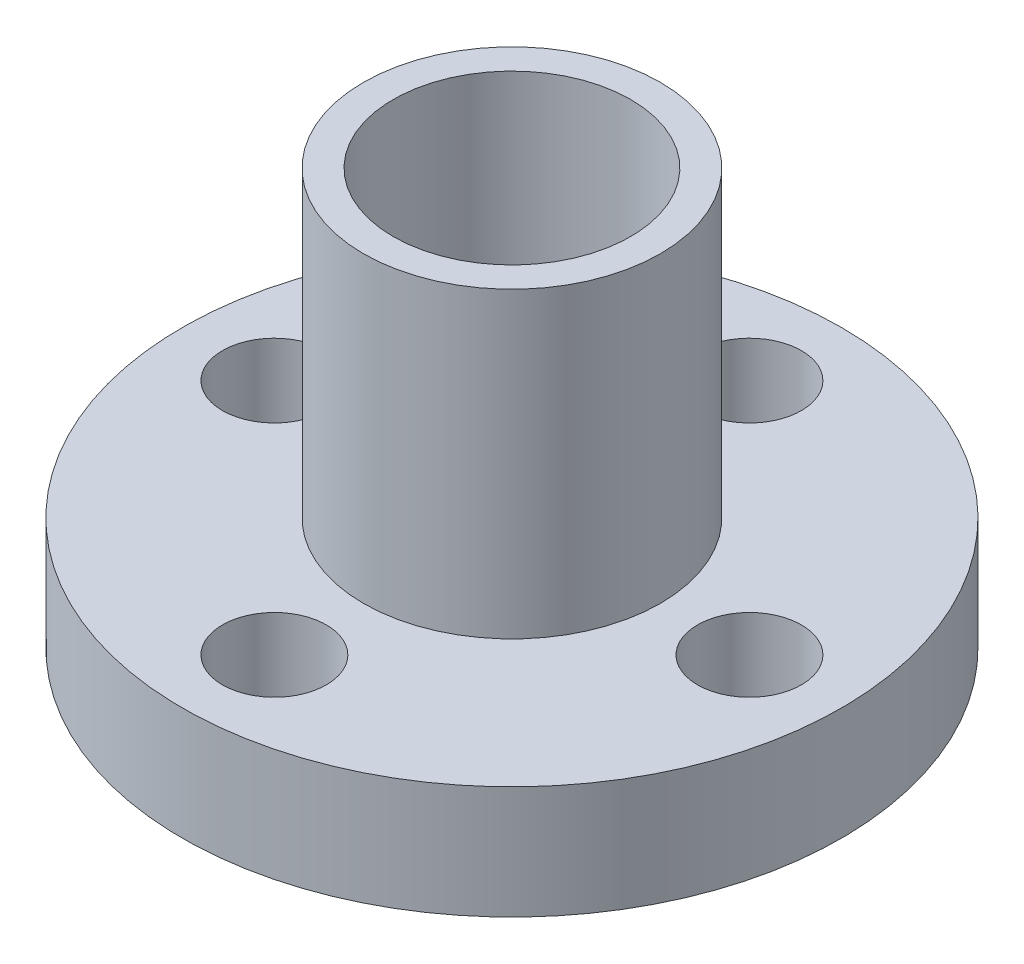
ISO-10303-21;
HEADER;
FILE_DESCRIPTION(('STEP AP214'),'2;1');
FILE_NAME('part.step','',(''),(''),'','','');
FILE_SCHEMA(('AUTOMOTIVE_DESIGN { 1 0 10303 214 1 1 1 1 }'));
ENDSEC;
DATA;
#1=APPLICATION_CONTEXT('core data for automotive mechanical design processes');
#2=APPLICATION_PROTOCOL_DEFINITION('international standard','automotive_design',2000,#1);
#3=PRODUCT_CONTEXT('',#1,'mechanical');
#4=PRODUCT('Part','Part','',(#3));
#5=PRODUCT_RELATED_PRODUCT_CATEGORY('part','',(#4));
#6=PRODUCT_DEFINITION_FORMATION('','',#4);
#7=PRODUCT_DEFINITION_CONTEXT('part definition',#1,'design');
#8=PRODUCT_DEFINITION('design','',#6,#7);
#9=PRODUCT_DEFINITION_SHAPE('','',#8);
#10=(LENGTH_UNIT() NAMED_UNIT(*) SI_UNIT(.MILLI.,.METRE.));
#11=(NAMED_UNIT(*) PLANE_ANGLE_UNIT() SI_UNIT($,.RADIAN.));
#12=(NAMED_UNIT(*) SI_UNIT($,.STERADIAN.) SOLID_ANGLE_UNIT());
#13=UNCERTAINTY_MEASURE_WITH_UNIT(LENGTH_MEASURE(1.E-05),#10,'distance_accuracy_value','');
#14=(GEOMETRIC_REPRESENTATION_CONTEXT(3) GLOBAL_UNCERTAINTY_ASSIGNED_CONTEXT((#13)) GLOBAL_UNIT_ASSIGNED_CONTEXT((#10,
#11,#12)) REPRESENTATION_CONTEXT('',''));
#15=CARTESIAN_POINT('',(0.,0.,0.));
#16=DIRECTION('',(0.,0.,1.));
#17=DIRECTION('',(1.,0.,0.));
#18=AXIS2_PLACEMENT_3D('',#15,#16,#17);
#19=CARTESIAN_POINT('',(0.,0.,0.));
#20=DIRECTION('',(0.,1.,0.));
#21=DIRECTION('',(0.,0.,1.));
#22=AXIS2_PLACEMENT_3D('',#19,#20,#21);
#23=PLANE('',#22);
#24=CARTESIAN_POINT('',(0.,0.,-8.));
#25=DIRECTION('',(0.,1.,0.));
#26=DIRECTION('',(0.,0.,1.));
#27=AXIS2_PLACEMENT_3D('',#24,#25,#26);
#28=CIRCLE('',#27,1.75);
#29=CARTESIAN_POINT('',(0.,0.,-6.25));
#30=VERTEX_POINT('',#29);
#31=EDGE_CURVE('E34',#30,#30,#28,.T.);
#32=ORIENTED_EDGE('',*,*,#31,.T.);
#33=EDGE_LOOP('',(#32));
#34=FACE_BOUND('',#33,.T.);
#35=CARTESIAN_POINT('',(0.,0.,8.));
#36=DIRECTION('',(0.,1.,0.));
#37=DIRECTION('',(0.,0.,1.));
#38=AXIS2_PLACEMENT_3D('',#35,#36,#37);
#39=CIRCLE('',#38,1.75);
#40=CARTESIAN_POINT('',(0.,0.,9.75));
#41=VERTEX_POINT('',#40);
#42=EDGE_CURVE('E74',#41,#41,#39,.T.);
#43=ORIENTED_EDGE('',*,*,#42,.T.);
#44=EDGE_LOOP('',(#43));
#45=FACE_BOUND('',#44,.T.);
#46=CARTESIAN_POINT('',(8.,0.,0.));
#47=DIRECTION('',(0.,1.,0.));
#48=DIRECTION('',(0.,0.,1.));
#49=AXIS2_PLACEMENT_3D('',#46,#47,#48);
#50=CIRCLE('',#49,1.75);
#51=CARTESIAN_POINT('',(8.,0.,1.75));
#52=VERTEX_POINT('',#51);
#53=EDGE_CURVE('E68',#52,#52,#50,.T.);
#54=ORIENTED_EDGE('',*,*,#53,.T.);
#55=EDGE_LOOP('',(#54));
#56=FACE_BOUND('',#55,.T.);
#57=CARTESIAN_POINT('',(-8.,0.,0.));
#58=DIRECTION('',(0.,1.,0.));
#59=DIRECTION('',(0.,0.,1.));
#60=AXIS2_PLACEMENT_3D('',#57,#58,#59);
#61=CIRCLE('',#60,1.75);
#62=CARTESIAN_POINT('',(-8.,0.,1.75));
#63=VERTEX_POINT('',#62);
#64=EDGE_CURVE('E62',#63,#63,#61,.T.);
#65=ORIENTED_EDGE('',*,*,#64,.T.);
#66=EDGE_LOOP('',(#65));
#67=FACE_BOUND('',#66,.T.);
#68=CARTESIAN_POINT('',(0.,0.,0.));
#69=DIRECTION('',(0.,1.,0.));
#70=DIRECTION('',(0.,0.,1.));
#71=AXIS2_PLACEMENT_3D('',#68,#69,#70);
#72=CIRCLE('',#71,11.1);
#73=CARTESIAN_POINT('',(0.,0.,-11.1));
#74=VERTEX_POINT('',#73);
#75=EDGE_CURVE('E42',#74,#74,#72,.T.);
#76=ORIENTED_EDGE('',*,*,#75,.F.);
#77=EDGE_LOOP('',(#76));
#78=FACE_BOUND('',#77,.T.);
#79=CARTESIAN_POINT('',(0.,0.,0.));
#80=DIRECTION('',(0.,1.,0.));
#81=DIRECTION('',(0.,0.,1.));
#82=AXIS2_PLACEMENT_3D('',#79,#80,#81);
#83=CIRCLE('',#82,5.09);
#84=CARTESIAN_POINT('',(0.,0.,5.09));
#85=VERTEX_POINT('',#84);
#86=EDGE_CURVE('E10',#85,#85,#83,.F.);
#87=ORIENTED_EDGE('',*,*,#86,.F.);
#88=EDGE_LOOP('',(#87));
#89=FACE_BOUND('',#88,.T.);
#90=ADVANCED_FACE('F30',(#34,#45,#56,#67,#78,#89),#23,.F.);
#91=CARTESIAN_POINT('',(0.,3.8,0.));
#92=DIRECTION('',(0.,-1.,0.));
#93=DIRECTION('',(0.,0.,-1.));
#94=AXIS2_PLACEMENT_3D('',#91,#92,#93);
#95=CYLINDRICAL_SURFACE('',#94,11.1);
#96=CARTESIAN_POINT('',(0.,3.8,0.));
#97=DIRECTION('',(0.,1.,0.));
#98=DIRECTION('',(0.,0.,1.));
#99=AXIS2_PLACEMENT_3D('',#96,#97,#98);
#100=CIRCLE('',#99,11.1);
#101=CARTESIAN_POINT('',(0.,3.8,-11.1));
#102=VERTEX_POINT('',#101);
#103=EDGE_CURVE('E38',#102,#102,#100,.T.);
#104=CARTESIAN_POINT('',(0.,3.8,-11.1));
#105=CARTESIAN_POINT('',(0.,3.76041666666667,-11.1));
#106=CARTESIAN_POINT('',(0.,3.72083333333333,-11.1));
#107=CARTESIAN_POINT('',(0.,3.64166666666667,-11.1));
#108=CARTESIAN_POINT('',(0.,3.60208333333333,-11.1));
#109=CARTESIAN_POINT('',(0.,3.52291666666667,-11.1));
#110=CARTESIAN_POINT('',(0.,3.48333333333333,-11.1));
#111=CARTESIAN_POINT('',(0.,3.40416666666667,-11.1));
#112=CARTESIAN_POINT('',(0.,3.36458333333333,-11.1));
#113=CARTESIAN_POINT('',(0.,3.28541666666667,-11.1));
#114=CARTESIAN_POINT('',(0.,3.24583333333333,-11.1));
#115=CARTESIAN_POINT('',(0.,3.16666666666667,-11.1));
#116=CARTESIAN_POINT('',(0.,3.12708333333333,-11.1));
#117=CARTESIAN_POINT('',(0.,3.04791666666667,-11.1));
#118=CARTESIAN_POINT('',(0.,3.00833333333333,-11.1));
#119=CARTESIAN_POINT('',(0.,2.92916666666667,-11.1));
#120=CARTESIAN_POINT('',(0.,2.88958333333333,-11.1));
#121=CARTESIAN_POINT('',(0.,2.81041666666667,-11.1));
#122=CARTESIAN_POINT('',(0.,2.77083333333333,-11.1));
#123=CARTESIAN_POINT('',(0.,2.69166666666667,-11.1));
#124=CARTESIAN_POINT('',(0.,2.65208333333333,-11.1));
#125=CARTESIAN_POINT('',(0.,2.57291666666667,-11.1));
#126=CARTESIAN_POINT('',(0.,2.53333333333333,-11.1));
#127=CARTESIAN_POINT('',(0.,2.45416666666667,-11.1));
#128=CARTESIAN_POINT('',(0.,2.41458333333333,-11.1));
#129=CARTESIAN_POINT('',(0.,2.33541666666667,-11.1));
#130=CARTESIAN_POINT('',(0.,2.29583333333333,-11.1));
#131=CARTESIAN_POINT('',(0.,2.21666666666667,-11.1));
#132=CARTESIAN_POINT('',(0.,2.17708333333333,-11.1));
#133=CARTESIAN_POINT('',(0.,2.09791666666667,-11.1));
#134=CARTESIAN_POINT('',(0.,2.05833333333333,-11.1));
#135=CARTESIAN_POINT('',(0.,1.97916666666667,-11.1));
#136=CARTESIAN_POINT('',(0.,1.93958333333333,-11.1));
#137=CARTESIAN_POINT('',(0.,1.86041666666667,-11.1));
#138=CARTESIAN_POINT('',(0.,1.82083333333333,-11.1));
#139=CARTESIAN_POINT('',(0.,1.74166666666667,-11.1));
#140=CARTESIAN_POINT('',(0.,1.70208333333333,-11.1));
#141=CARTESIAN_POINT('',(0.,1.62291666666667,-11.1));
#142=CARTESIAN_POINT('',(0.,1.58333333333333,-11.1));
#143=CARTESIAN_POINT('',(0.,1.50416666666667,-11.1));
#144=CARTESIAN_POINT('',(0.,1.46458333333333,-11.1));
#145=CARTESIAN_POINT('',(0.,1.38541666666667,-11.1));
#146=CARTESIAN_POINT('',(0.,1.34583333333333,-11.1));
#147=CARTESIAN_POINT('',(0.,1.26666666666667,-11.1));
#148=CARTESIAN_POINT('',(0.,1.22708333333333,-11.1));
#149=CARTESIAN_POINT('',(0.,1.14791666666667,-11.1));
#150=CARTESIAN_POINT('',(0.,1.10833333333333,-11.1));
#151=CARTESIAN_POINT('',(0.,1.02916666666667,-11.1));
#152=CARTESIAN_POINT('',(0.,0.989583333333334,-11.1));
#153=CARTESIAN_POINT('',(0.,0.910416666666667,-11.1));
#154=CARTESIAN_POINT('',(0.,0.870833333333333,-11.1));
#155=CARTESIAN_POINT('',(0.,0.791666666666667,-11.1));
#156=CARTESIAN_POINT('',(0.,0.752083333333333,-11.1));
#157=CARTESIAN_POINT('',(0.,0.672916666666667,-11.1));
#158=CARTESIAN_POINT('',(0.,0.633333333333333,-11.1));
#159=CARTESIAN_POINT('',(0.,0.554166666666667,-11.1));
#160=CARTESIAN_POINT('',(0.,0.514583333333334,-11.1));
#161=CARTESIAN_POINT('',(0.,0.435416666666667,-11.1));
#162=CARTESIAN_POINT('',(0.,0.395833333333334,-11.1));
#163=CARTESIAN_POINT('',(0.,0.316666666666667,-11.1));
#164=CARTESIAN_POINT('',(0.,0.277083333333333,-11.1));
#165=CARTESIAN_POINT('',(0.,0.197916666666667,-11.1));
#166=CARTESIAN_POINT('',(0.,0.158333333333333,-11.1));
#167=CARTESIAN_POINT('',(0.,0.0791666666666666,-11.1));
#168=CARTESIAN_POINT('',(0.,0.0395833333333333,-11.1));
#169=CARTESIAN_POINT('',(0.,0.,-11.1));
#170=B_SPLINE_CURVE_WITH_KNOTS('',3,(#104,#105,#106,#107,#108,#109,#110,#111,#112,#113,#114,
#115,#116,#117,#118,#119,#120,#121,#122,#123,#124,#125,#126,#127,#128,#129,#130,#131,#132,#133,
#134,#135,#136,#137,#138,#139,#140,#141,#142,#143,#144,#145,#146,#147,#148,#149,#150,#151,#152,
#153,#154,#155,#156,#157,#158,#159,#160,#161,#162,#163,#164,#165,#166,#167,#168,#169),
.UNSPECIFIED.,.F.,.F.,(4,2,2,2,2,2,2,2,2,2,2,2,2,2,2,2,2,2,2,2,2,2,2,2,2,2,2,2,2,2,2,2,4),(0.,
0.11875,0.2375,0.35625,0.475,0.59375,0.7125,0.83125,0.95,1.06875,1.1875,1.30625,1.425,1.54375,
1.6625,1.78125,1.9,2.01875,2.1375,2.25625,2.375,2.49375,2.6125,2.73125,2.85,2.96875,3.0875,
3.20625,3.325,3.44375,3.5625,3.68125,3.8),.UNSPECIFIED.);
#171=EDGE_CURVE('BSEAM32',#102,#74,#170,.T.);
#172=ORIENTED_EDGE('',*,*,#103,.F.);
#173=ORIENTED_EDGE('',*,*,#75,.T.);
#174=ORIENTED_EDGE('',*,*,#171,.T.);
#175=ORIENTED_EDGE('',*,*,#171,.F.);
#176=EDGE_LOOP('',(#172,#174,#173,#175));
#177=FACE_BOUND('',#176,.T.);
#178=ADVANCED_FACE('F32',(#177),#95,.T.);
#179=CARTESIAN_POINT('',(0.,3.8,0.));
#180=DIRECTION('',(0.,1.,0.));
#181=DIRECTION('',(0.,0.,1.));
#182=AXIS2_PLACEMENT_3D('',#179,#180,#181);
#183=PLANE('',#182);
#184=CARTESIAN_POINT('',(0.,3.8,-8.));
#185=DIRECTION('',(0.,1.,0.));
#186=DIRECTION('',(0.,0.,1.));
#187=AXIS2_PLACEMENT_3D('',#184,#185,#186);
#188=CIRCLE('',#187,1.75);
#189=CARTESIAN_POINT('',(0.,3.8,-6.25));
#190=VERTEX_POINT('',#189);
#191=EDGE_CURVE('E80',#190,#190,#188,.T.);
#192=ORIENTED_EDGE('',*,*,#191,.F.);
#193=EDGE_LOOP('',(#192));
#194=FACE_BOUND('',#193,.T.);
#195=CARTESIAN_POINT('',(0.,3.8,8.));
#196=DIRECTION('',(0.,1.,0.));
#197=DIRECTION('',(0.,0.,1.));
#198=AXIS2_PLACEMENT_3D('',#195,#196,#197);
#199=CIRCLE('',#198,1.75);
#200=CARTESIAN_POINT('',(0.,3.8,9.75));
#201=VERTEX_POINT('',#200);
#202=EDGE_CURVE('E77',#201,#201,#199,.T.);
#203=ORIENTED_EDGE('',*,*,#202,.F.);
#204=EDGE_LOOP('',(#203));
#205=FACE_BOUND('',#204,.T.);
#206=CARTESIAN_POINT('',(8.,3.8,0.));
#207=DIRECTION('',(0.,1.,0.));
#208=DIRECTION('',(0.,0.,1.));
#209=AXIS2_PLACEMENT_3D('',#206,#207,#208);
#210=CIRCLE('',#209,1.75);
#211=CARTESIAN_POINT('',(8.,3.8,1.75));
#212=VERTEX_POINT('',#211);
#213=EDGE_CURVE('E71',#212,#212,#210,.T.);
#214=ORIENTED_EDGE('',*,*,#213,.F.);
#215=EDGE_LOOP('',(#214));
#216=FACE_BOUND('',#215,.T.);
#217=CARTESIAN_POINT('',(-8.,3.8,0.));
#218=DIRECTION('',(0.,1.,0.));
#219=DIRECTION('',(0.,0.,1.));
#220=AXIS2_PLACEMENT_3D('',#217,#218,#219);
#221=CIRCLE('',#220,1.75);
#222=CARTESIAN_POINT('',(-8.,3.8,1.75));
#223=VERTEX_POINT('',#222);
#224=EDGE_CURVE('E65',#223,#223,#221,.T.);
#225=ORIENTED_EDGE('',*,*,#224,.F.);
#226=EDGE_LOOP('',(#225));
#227=FACE_BOUND('',#226,.T.);
#228=CARTESIAN_POINT('',(0.,3.8,0.));
#229=DIRECTION('',(0.,1.,0.));
#230=DIRECTION('',(0.,0.,1.));
#231=AXIS2_PLACEMENT_3D('',#228,#229,#230);
#232=CIRCLE('',#231,5.);
#233=CARTESIAN_POINT('',(0.,3.8,5.));
#234=VERTEX_POINT('',#233);
#235=EDGE_CURVE('E46',#234,#234,#232,.F.);
#236=ORIENTED_EDGE('',*,*,#235,.T.);
#237=EDGE_LOOP('',(#236));
#238=FACE_BOUND('',#237,.T.);
#239=ORIENTED_EDGE('',*,*,#103,.T.);
#240=EDGE_LOOP('',(#239));
#241=FACE_BOUND('',#240,.T.);
#242=ADVANCED_FACE('F103',(#194,#205,#216,#227,#238,#241),#183,.T.);
#243=CARTESIAN_POINT('',(0.,14.,0.));
#244=DIRECTION('',(0.,-1.,0.));
#245=DIRECTION('',(0.,0.,-1.));
#246=AXIS2_PLACEMENT_3D('',#243,#244,#245);
#247=CYLINDRICAL_SURFACE('',#246,5.);
#248=ORIENTED_EDGE('',*,*,#235,.F.);
#249=EDGE_LOOP('',(#248));
#250=FACE_BOUND('',#249,.T.);
#251=CARTESIAN_POINT('',(0.,14.,0.));
#252=DIRECTION('',(0.,1.,0.));
#253=DIRECTION('',(0.,0.,1.));
#254=AXIS2_PLACEMENT_3D('',#251,#252,#253);
#255=CIRCLE('',#254,5.);
#256=CARTESIAN_POINT('',(0.,14.,5.));
#257=VERTEX_POINT('',#256);
#258=EDGE_CURVE('E50',#257,#257,#255,.T.);
#259=ORIENTED_EDGE('',*,*,#258,.F.);
#260=EDGE_LOOP('',(#259));
#261=FACE_BOUND('',#260,.T.);
#262=ADVANCED_FACE('F108',(#250,#261),#247,.T.);
#263=CARTESIAN_POINT('',(0.,14.,0.));
#264=DIRECTION('',(0.,1.,0.));
#265=DIRECTION('',(0.,0.,1.));
#266=AXIS2_PLACEMENT_3D('',#263,#264,#265);
#267=PLANE('',#266);
#268=CARTESIAN_POINT('',(0.,14.,0.));
#269=DIRECTION('',(0.,1.,0.));
#270=DIRECTION('',(0.,0.,1.));
#271=AXIS2_PLACEMENT_3D('',#268,#269,#270);
#272=CIRCLE('',#271,4.);
#273=CARTESIAN_POINT('',(0.,14.,4.));
#274=VERTEX_POINT('',#273);
#275=EDGE_CURVE('E53',#274,#274,#272,.T.);
#276=ORIENTED_EDGE('',*,*,#275,.F.);
#277=EDGE_LOOP('',(#276));
#278=FACE_BOUND('',#277,.T.);
#279=ORIENTED_EDGE('',*,*,#258,.T.);
#280=EDGE_LOOP('',(#279));
#281=FACE_BOUND('',#280,.T.);
#282=ADVANCED_FACE('F112',(#278,#281),#267,.T.);
#283=CARTESIAN_POINT('',(0.,0.,0.));
#284=DIRECTION('',(0.,1.,0.));
#285=DIRECTION('',(0.,0.,1.));
#286=AXIS2_PLACEMENT_3D('',#283,#284,#285);
#287=CYLINDRICAL_SURFACE('',#286,4.);
#288=ORIENTED_EDGE('',*,*,#275,.T.);
#289=EDGE_LOOP('',(#288));
#290=FACE_BOUND('',#289,.T.);
#291=CARTESIAN_POINT('',(0.,-1.67,0.));
#292=DIRECTION('',(0.,-1.,0.));
#293=DIRECTION('',(0.,0.,-1.));
#294=AXIS2_PLACEMENT_3D('',#291,#292,#293);
#295=CIRCLE('',#294,4.);
#296=CARTESIAN_POINT('',(0.,-1.67,-4.));
#297=VERTEX_POINT('',#296);
#298=EDGE_CURVE('E59',#297,#297,#295,.T.);
#299=ORIENTED_EDGE('',*,*,#298,.T.);
#300=EDGE_LOOP('',(#299));
#301=FACE_BOUND('',#300,.T.);
#302=ADVANCED_FACE('F116',(#290,#301),#287,.F.);
#303=CARTESIAN_POINT('',(0.,-1.67,0.));
#304=DIRECTION('',(0.,-1.,0.));
#305=DIRECTION('',(0.,0.,-1.));
#306=AXIS2_PLACEMENT_3D('',#303,#304,#305);
#307=PLANE('',#306);
#308=CARTESIAN_POINT('',(0.,-1.67,0.));
#309=DIRECTION('',(0.,-1.,0.));
#310=DIRECTION('',(0.,0.,-1.));
#311=AXIS2_PLACEMENT_3D('',#308,#309,#310);
#312=CIRCLE('',#311,5.09);
#313=CARTESIAN_POINT('',(0.,-1.67,-5.09));
#314=VERTEX_POINT('',#313);
#315=EDGE_CURVE('E56',#314,#314,#312,.T.);
#316=ORIENTED_EDGE('',*,*,#315,.T.);
#317=EDGE_LOOP('',(#316));
#318=FACE_BOUND('',#317,.T.);
#319=ORIENTED_EDGE('',*,*,#298,.F.);
#320=EDGE_LOOP('',(#319));
#321=FACE_BOUND('',#320,.T.);
#322=ADVANCED_FACE('F120',(#318,#321),#307,.T.);
#323=CARTESIAN_POINT('',(0.,-1.67,0.));
#324=DIRECTION('',(0.,1.,0.));
#325=DIRECTION('',(0.,0.,1.));
#326=AXIS2_PLACEMENT_3D('',#323,#324,#325);
#327=CYLINDRICAL_SURFACE('',#326,5.09);
#328=ORIENTED_EDGE('',*,*,#315,.F.);
#329=EDGE_LOOP('',(#328));
#330=FACE_BOUND('',#329,.T.);
#331=ORIENTED_EDGE('',*,*,#86,.T.);
#332=EDGE_LOOP('',(#331));
#333=FACE_BOUND('',#332,.T.);
#334=ADVANCED_FACE('F122',(#330,#333),#327,.T.);
#335=CARTESIAN_POINT('',(-8.,3.8,0.));
#336=DIRECTION('',(0.,1.,0.));
#337=DIRECTION('',(0.,0.,1.));
#338=AXIS2_PLACEMENT_3D('',#335,#336,#337);
#339=CYLINDRICAL_SURFACE('',#338,1.75);
#340=ORIENTED_EDGE('',*,*,#224,.T.);
#341=EDGE_LOOP('',(#340));
#342=FACE_BOUND('',#341,.T.);
#343=ORIENTED_EDGE('',*,*,#64,.F.);
#344=EDGE_LOOP('',(#343));
#345=FACE_BOUND('',#344,.T.);
#346=ADVANCED_FACE('F125',(#342,#345),#339,.F.);
#347=CARTESIAN_POINT('',(8.,3.8,0.));
#348=DIRECTION('',(0.,1.,0.));
#349=DIRECTION('',(0.,0.,1.));
#350=AXIS2_PLACEMENT_3D('',#347,#348,#349);
#351=CYLINDRICAL_SURFACE('',#350,1.75);
#352=ORIENTED_EDGE('',*,*,#213,.T.);
#353=EDGE_LOOP('',(#352));
#354=FACE_BOUND('',#353,.T.);
#355=ORIENTED_EDGE('',*,*,#53,.F.);
#356=EDGE_LOOP('',(#355));
#357=FACE_BOUND('',#356,.T.);
#358=ADVANCED_FACE('F96',(#354,#357),#351,.F.);
#359=CARTESIAN_POINT('',(0.,3.8,8.));
#360=DIRECTION('',(0.,1.,0.));
#361=DIRECTION('',(0.,0.,1.));
#362=AXIS2_PLACEMENT_3D('',#359,#360,#361);
#363=CYLINDRICAL_SURFACE('',#362,1.75);
#364=ORIENTED_EDGE('',*,*,#202,.T.);
#365=EDGE_LOOP('',(#364));
#366=FACE_BOUND('',#365,.T.);
#367=ORIENTED_EDGE('',*,*,#42,.F.);
#368=EDGE_LOOP('',(#367));
#369=FACE_BOUND('',#368,.T.);
#370=ADVANCED_FACE('F91',(#366,#369),#363,.F.);
#371=CARTESIAN_POINT('',(0.,3.8,-8.));
#372=DIRECTION('',(0.,1.,0.));
#373=DIRECTION('',(0.,0.,1.));
#374=AXIS2_PLACEMENT_3D('',#371,#372,#373);
#375=CYLINDRICAL_SURFACE('',#374,1.75);
#376=ORIENTED_EDGE('',*,*,#191,.T.);
#377=EDGE_LOOP('',(#376));
#378=FACE_BOUND('',#377,.T.);
#379=ORIENTED_EDGE('',*,*,#31,.F.);
#380=EDGE_LOOP('',(#379));
#381=FACE_BOUND('',#380,.T.);
#382=ADVANCED_FACE('F89',(#378,#381),#375,.F.);
#383=CLOSED_SHELL('',(#90,#178,#242,#262,#282,#302,#322,#334,#346,#358,#370,#382));
#384=MANIFOLD_SOLID_BREP('B2',#383);
#385=ADVANCED_BREP_SHAPE_REPRESENTATION('',(#18,#384),#14);
#386=SHAPE_DEFINITION_REPRESENTATION(#9,#385);
ENDSEC;
END-ISO-10303-21;
